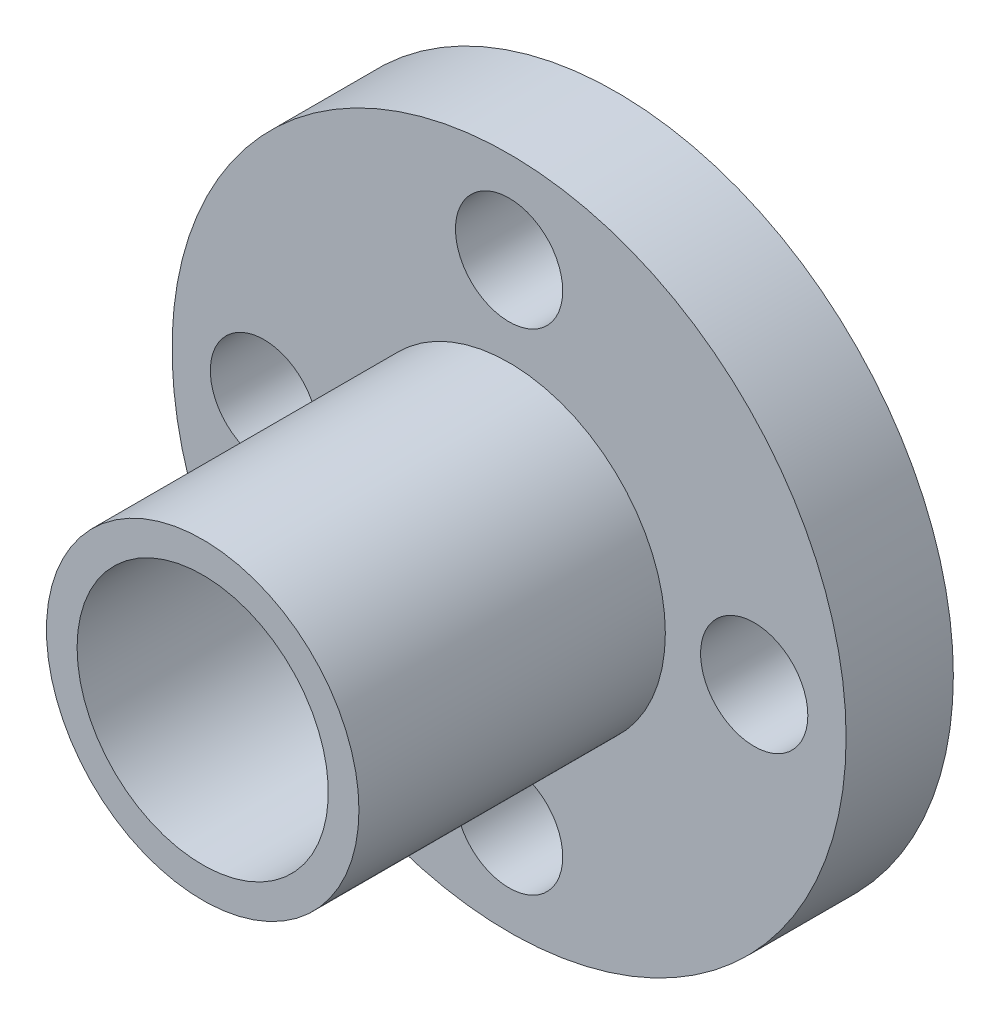
ISO-10303-21;
HEADER;
FILE_DESCRIPTION(('STEP AP214'),'2;1');
FILE_NAME('part.step','',(''),(''),'','','');
FILE_SCHEMA(('AUTOMOTIVE_DESIGN { 1 0 10303 214 1 1 1 1 }'));
ENDSEC;
DATA;
#1=APPLICATION_CONTEXT('core data for automotive mechanical design processes');
#2=APPLICATION_PROTOCOL_DEFINITION('international standard','automotive_design',2000,#1);
#3=PRODUCT_CONTEXT('',#1,'mechanical');
#4=PRODUCT('Part','Part','',(#3));
#5=PRODUCT_RELATED_PRODUCT_CATEGORY('part','',(#4));
#6=PRODUCT_DEFINITION_FORMATION('','',#4);
#7=PRODUCT_DEFINITION_CONTEXT('part definition',#1,'design');
#8=PRODUCT_DEFINITION('design','',#6,#7);
#9=PRODUCT_DEFINITION_SHAPE('','',#8);
#10=(LENGTH_UNIT() NAMED_UNIT(*) SI_UNIT(.MILLI.,.METRE.));
#11=(NAMED_UNIT(*) PLANE_ANGLE_UNIT() SI_UNIT($,.RADIAN.));
#12=(NAMED_UNIT(*) SI_UNIT($,.STERADIAN.) SOLID_ANGLE_UNIT());
#13=UNCERTAINTY_MEASURE_WITH_UNIT(LENGTH_MEASURE(1.E-05),#10,'distance_accuracy_value','');
#14=(GEOMETRIC_REPRESENTATION_CONTEXT(3) GLOBAL_UNCERTAINTY_ASSIGNED_CONTEXT((#13)) GLOBAL_UNIT_ASSIGNED_CONTEXT((#10,
#11,#12)) REPRESENTATION_CONTEXT('',''));
#15=CARTESIAN_POINT('',(0.,0.,0.));
#16=DIRECTION('',(0.,0.,1.));
#17=DIRECTION('',(1.,0.,0.));
#18=AXIS2_PLACEMENT_3D('',#15,#16,#17);
#19=CARTESIAN_POINT('',(0.,0.,15.));
#20=DIRECTION('',(0.,0.,-1.));
#21=DIRECTION('',(-1.,0.,0.));
#22=AXIS2_PLACEMENT_3D('',#19,#20,#21);
#23=CYLINDRICAL_SURFACE('',#22,5.1);
#24=CARTESIAN_POINT('',(0.,0.,5.));
#25=DIRECTION('',(0.,0.,1.));
#26=DIRECTION('',(1.,0.,0.));
#27=AXIS2_PLACEMENT_3D('',#24,#25,#26);
#28=CIRCLE('',#27,5.1);
#29=CARTESIAN_POINT('',(5.1,0.,5.));
#30=VERTEX_POINT('',#29);
#31=EDGE_CURVE('E36',#30,#30,#28,.T.);
#32=ORIENTED_EDGE('',*,*,#31,.T.);
#33=EDGE_LOOP('',(#32));
#34=FACE_BOUND('',#33,.T.);
#35=CARTESIAN_POINT('',(0.,0.,15.));
#36=DIRECTION('',(0.,0.,1.));
#37=DIRECTION('',(1.,0.,0.));
#38=AXIS2_PLACEMENT_3D('',#35,#36,#37);
#39=CIRCLE('',#38,5.1);
#40=CARTESIAN_POINT('',(5.1,0.,15.));
#41=VERTEX_POINT('',#40);
#42=EDGE_CURVE('E40',#41,#41,#39,.T.);
#43=ORIENTED_EDGE('',*,*,#42,.F.);
#44=EDGE_LOOP('',(#43));
#45=FACE_BOUND('',#44,.T.);
#46=ADVANCED_FACE('F33',(#34,#45),#23,.T.);
#47=CARTESIAN_POINT('',(0.,0.,15.));
#48=DIRECTION('',(0.,0.,1.));
#49=DIRECTION('',(1.,0.,0.));
#50=AXIS2_PLACEMENT_3D('',#47,#48,#49);
#51=PLANE('',#50);
#52=CARTESIAN_POINT('',(0.,0.,15.));
#53=DIRECTION('',(0.,0.,-1.));
#54=DIRECTION('',(-1.,0.,0.));
#55=AXIS2_PLACEMENT_3D('',#52,#53,#54);
#56=CIRCLE('',#55,4.1);
#57=CARTESIAN_POINT('',(-4.1,0.,15.));
#58=VERTEX_POINT('',#57);
#59=EDGE_CURVE('E77',#58,#58,#56,.T.);
#60=ORIENTED_EDGE('',*,*,#59,.T.);
#61=EDGE_LOOP('',(#60));
#62=FACE_BOUND('',#61,.T.);
#63=ORIENTED_EDGE('',*,*,#42,.T.);
#64=EDGE_LOOP('',(#63));
#65=FACE_BOUND('',#64,.T.);
#66=ADVANCED_FACE('F86',(#62,#65),#51,.T.);
#67=CARTESIAN_POINT('',(0.,0.,5.));
#68=DIRECTION('',(0.,0.,1.));
#69=DIRECTION('',(1.,0.,0.));
#70=AXIS2_PLACEMENT_3D('',#67,#68,#69);
#71=PLANE('',#70);
#72=ORIENTED_EDGE('',*,*,#31,.F.);
#73=EDGE_LOOP('',(#72));
#74=FACE_BOUND('',#73,.T.);
#75=CARTESIAN_POINT('',(4.52787916007828E-13,-8.,5.));
#76=DIRECTION('',(0.,0.,1.));
#77=DIRECTION('',(1.,0.,0.));
#78=AXIS2_PLACEMENT_3D('',#75,#76,#77);
#79=CIRCLE('',#78,1.75000000000049);
#80=CARTESIAN_POINT('',(1.75000000000094,-8.,5.));
#81=VERTEX_POINT('',#80);
#82=EDGE_CURVE('E65',#81,#81,#79,.T.);
#83=ORIENTED_EDGE('',*,*,#82,.F.);
#84=EDGE_LOOP('',(#83));
#85=FACE_BOUND('',#84,.T.);
#86=CARTESIAN_POINT('',(0.,8.,5.));
#87=DIRECTION('',(0.,0.,1.));
#88=DIRECTION('',(1.,0.,0.));
#89=AXIS2_PLACEMENT_3D('',#86,#87,#88);
#90=CIRCLE('',#89,1.75);
#91=CARTESIAN_POINT('',(1.75,8.,5.));
#92=VERTEX_POINT('',#91);
#93=EDGE_CURVE('E53',#92,#92,#90,.T.);
#94=ORIENTED_EDGE('',*,*,#93,.F.);
#95=EDGE_LOOP('',(#94));
#96=FACE_BOUND('',#95,.T.);
#97=CARTESIAN_POINT('',(0.,0.,5.));
#98=DIRECTION('',(0.,0.,1.));
#99=DIRECTION('',(1.,0.,0.));
#100=AXIS2_PLACEMENT_3D('',#97,#98,#99);
#101=CIRCLE('',#100,11.);
#102=CARTESIAN_POINT('',(11.,0.,5.));
#103=VERTEX_POINT('',#102);
#104=EDGE_CURVE('E52',#103,#103,#101,.T.);
#105=ORIENTED_EDGE('',*,*,#104,.T.);
#106=EDGE_LOOP('',(#105));
#107=FACE_BOUND('',#106,.T.);
#108=CARTESIAN_POINT('',(8.00000000000023,2.26393958003914E-13,5.));
#109=DIRECTION('',(0.,0.,1.));
#110=DIRECTION('',(1.,0.,0.));
#111=AXIS2_PLACEMENT_3D('',#108,#109,#110);
#112=CIRCLE('',#111,1.75000000000018);
#113=CARTESIAN_POINT('',(9.7500000000004,2.26393958003914E-13,5.));
#114=VERTEX_POINT('',#113);
#115=EDGE_CURVE('E59',#114,#114,#112,.T.);
#116=ORIENTED_EDGE('',*,*,#115,.F.);
#117=EDGE_LOOP('',(#116));
#118=FACE_BOUND('',#117,.T.);
#119=CARTESIAN_POINT('',(-7.99999999999977,-2.27373675443232E-13,5.));
#120=DIRECTION('',(0.,0.,1.));
#121=DIRECTION('',(1.,0.,0.));
#122=AXIS2_PLACEMENT_3D('',#119,#120,#121);
#123=CIRCLE('',#122,1.75000000000036);
#124=CARTESIAN_POINT('',(-6.24999999999941,-2.27373675443232E-13,5.));
#125=VERTEX_POINT('',#124);
#126=EDGE_CURVE('E71',#125,#125,#123,.T.);
#127=ORIENTED_EDGE('',*,*,#126,.F.);
#128=EDGE_LOOP('',(#127));
#129=FACE_BOUND('',#128,.T.);
#130=ADVANCED_FACE('F111',(#74,#85,#96,#107,#118,#129),#71,.T.);
#131=CARTESIAN_POINT('',(0.,0.,1.5));
#132=DIRECTION('',(0.,0.,1.));
#133=DIRECTION('',(1.,0.,0.));
#134=AXIS2_PLACEMENT_3D('',#131,#132,#133);
#135=PLANE('',#134);
#136=CARTESIAN_POINT('',(0.,0.,1.5));
#137=DIRECTION('',(0.,0.,1.));
#138=DIRECTION('',(1.,0.,0.));
#139=AXIS2_PLACEMENT_3D('',#136,#137,#138);
#140=CIRCLE('',#139,5.1);
#141=CARTESIAN_POINT('',(5.1,0.,1.5));
#142=VERTEX_POINT('',#141);
#143=EDGE_CURVE('E10',#142,#142,#140,.T.);
#144=ORIENTED_EDGE('',*,*,#143,.T.);
#145=EDGE_LOOP('',(#144));
#146=FACE_BOUND('',#145,.T.);
#147=CARTESIAN_POINT('',(0.,0.,1.5));
#148=DIRECTION('',(0.,0.,1.));
#149=DIRECTION('',(1.,0.,0.));
#150=AXIS2_PLACEMENT_3D('',#147,#148,#149);
#151=CIRCLE('',#150,11.);
#152=CARTESIAN_POINT('',(11.,0.,1.5));
#153=VERTEX_POINT('',#152);
#154=EDGE_CURVE('E49',#153,#153,#151,.T.);
#155=ORIENTED_EDGE('',*,*,#154,.F.);
#156=EDGE_LOOP('',(#155));
#157=FACE_BOUND('',#156,.T.);
#158=CARTESIAN_POINT('',(0.,8.,1.5));
#159=DIRECTION('',(0.,0.,1.));
#160=DIRECTION('',(1.,0.,0.));
#161=AXIS2_PLACEMENT_3D('',#158,#159,#160);
#162=CIRCLE('',#161,1.75);
#163=CARTESIAN_POINT('',(1.75,8.,1.5));
#164=VERTEX_POINT('',#163);
#165=EDGE_CURVE('E56',#164,#164,#162,.T.);
#166=ORIENTED_EDGE('',*,*,#165,.T.);
#167=EDGE_LOOP('',(#166));
#168=FACE_BOUND('',#167,.T.);
#169=CARTESIAN_POINT('',(8.00000000000023,2.26393958003914E-13,1.5));
#170=DIRECTION('',(0.,0.,1.));
#171=DIRECTION('',(1.,0.,0.));
#172=AXIS2_PLACEMENT_3D('',#169,#170,#171);
#173=CIRCLE('',#172,1.75000000000018);
#174=CARTESIAN_POINT('',(9.7500000000004,2.26393958003914E-13,1.5));
#175=VERTEX_POINT('',#174);
#176=EDGE_CURVE('E62',#175,#175,#173,.T.);
#177=ORIENTED_EDGE('',*,*,#176,.T.);
#178=EDGE_LOOP('',(#177));
#179=FACE_BOUND('',#178,.T.);
#180=CARTESIAN_POINT('',(4.52787916007828E-13,-8.,1.5));
#181=DIRECTION('',(0.,0.,1.));
#182=DIRECTION('',(1.,0.,0.));
#183=AXIS2_PLACEMENT_3D('',#180,#181,#182);
#184=CIRCLE('',#183,1.75000000000049);
#185=CARTESIAN_POINT('',(1.75000000000094,-8.,1.5));
#186=VERTEX_POINT('',#185);
#187=EDGE_CURVE('E68',#186,#186,#184,.T.);
#188=ORIENTED_EDGE('',*,*,#187,.T.);
#189=EDGE_LOOP('',(#188));
#190=FACE_BOUND('',#189,.T.);
#191=CARTESIAN_POINT('',(-7.99999999999977,-2.27373675443232E-13,1.5));
#192=DIRECTION('',(0.,0.,1.));
#193=DIRECTION('',(1.,0.,0.));
#194=AXIS2_PLACEMENT_3D('',#191,#192,#193);
#195=CIRCLE('',#194,1.75000000000036);
#196=CARTESIAN_POINT('',(-6.24999999999941,-2.27373675443232E-13,1.5));
#197=VERTEX_POINT('',#196);
#198=EDGE_CURVE('E74',#197,#197,#195,.T.);
#199=ORIENTED_EDGE('',*,*,#198,.T.);
#200=EDGE_LOOP('',(#199));
#201=FACE_BOUND('',#200,.T.);
#202=ADVANCED_FACE('F120',(#146,#157,#168,#179,#190,#201),#135,.F.);
#203=CARTESIAN_POINT('',(0.,0.,5.));
#204=DIRECTION('',(0.,0.,-1.));
#205=DIRECTION('',(-1.,0.,0.));
#206=AXIS2_PLACEMENT_3D('',#203,#204,#205);
#207=CYLINDRICAL_SURFACE('',#206,11.);
#208=ORIENTED_EDGE('',*,*,#104,.F.);
#209=EDGE_LOOP('',(#208));
#210=FACE_BOUND('',#209,.T.);
#211=ORIENTED_EDGE('',*,*,#154,.T.);
#212=EDGE_LOOP('',(#211));
#213=FACE_BOUND('',#212,.T.);
#214=ADVANCED_FACE('F139',(#210,#213),#207,.T.);
#215=CARTESIAN_POINT('',(0.,8.,5.));
#216=DIRECTION('',(0.,0.,-1.));
#217=DIRECTION('',(-1.,0.,0.));
#218=AXIS2_PLACEMENT_3D('',#215,#216,#217);
#219=CYLINDRICAL_SURFACE('',#218,1.75);
#220=ORIENTED_EDGE('',*,*,#93,.T.);
#221=EDGE_LOOP('',(#220));
#222=FACE_BOUND('',#221,.T.);
#223=ORIENTED_EDGE('',*,*,#165,.F.);
#224=EDGE_LOOP('',(#223));
#225=FACE_BOUND('',#224,.T.);
#226=ADVANCED_FACE('F144',(#222,#225),#219,.F.);
#227=CARTESIAN_POINT('',(8.00000000000023,2.26393958003914E-13,5.));
#228=DIRECTION('',(0.,0.,-1.));
#229=DIRECTION('',(-1.,0.,0.));
#230=AXIS2_PLACEMENT_3D('',#227,#228,#229);
#231=CYLINDRICAL_SURFACE('',#230,1.75000000000018);
#232=ORIENTED_EDGE('',*,*,#115,.T.);
#233=EDGE_LOOP('',(#232));
#234=FACE_BOUND('',#233,.T.);
#235=ORIENTED_EDGE('',*,*,#176,.F.);
#236=EDGE_LOOP('',(#235));
#237=FACE_BOUND('',#236,.T.);
#238=ADVANCED_FACE('F151',(#234,#237),#231,.F.);
#239=CARTESIAN_POINT('',(4.52787916007828E-13,-8.,5.));
#240=DIRECTION('',(0.,0.,-1.));
#241=DIRECTION('',(-1.,0.,0.));
#242=AXIS2_PLACEMENT_3D('',#239,#240,#241);
#243=CYLINDRICAL_SURFACE('',#242,1.75000000000049);
#244=ORIENTED_EDGE('',*,*,#82,.T.);
#245=EDGE_LOOP('',(#244));
#246=FACE_BOUND('',#245,.T.);
#247=ORIENTED_EDGE('',*,*,#187,.F.);
#248=EDGE_LOOP('',(#247));
#249=FACE_BOUND('',#248,.T.);
#250=ADVANCED_FACE('F134',(#246,#249),#243,.F.);
#251=CARTESIAN_POINT('',(-7.99999999999977,-2.27373675443232E-13,5.));
#252=DIRECTION('',(0.,0.,-1.));
#253=DIRECTION('',(-1.,0.,0.));
#254=AXIS2_PLACEMENT_3D('',#251,#252,#253);
#255=CYLINDRICAL_SURFACE('',#254,1.75000000000036);
#256=ORIENTED_EDGE('',*,*,#126,.T.);
#257=EDGE_LOOP('',(#256));
#258=FACE_BOUND('',#257,.T.);
#259=ORIENTED_EDGE('',*,*,#198,.F.);
#260=EDGE_LOOP('',(#259));
#261=FACE_BOUND('',#260,.T.);
#262=ADVANCED_FACE('F99',(#258,#261),#255,.F.);
#263=CARTESIAN_POINT('',(0.,0.,0.));
#264=DIRECTION('',(0.,0.,1.));
#265=DIRECTION('',(1.,0.,0.));
#266=AXIS2_PLACEMENT_3D('',#263,#264,#265);
#267=PLANE('',#266);
#268=CARTESIAN_POINT('',(0.,0.,0.));
#269=DIRECTION('',(0.,0.,-1.));
#270=DIRECTION('',(-1.,0.,0.));
#271=AXIS2_PLACEMENT_3D('',#268,#269,#270);
#272=CIRCLE('',#271,4.1);
#273=CARTESIAN_POINT('',(-4.1,0.,0.));
#274=VERTEX_POINT('',#273);
#275=EDGE_CURVE('E80',#274,#274,#272,.T.);
#276=ORIENTED_EDGE('',*,*,#275,.F.);
#277=EDGE_LOOP('',(#276));
#278=FACE_BOUND('',#277,.T.);
#279=CARTESIAN_POINT('',(0.,0.,0.));
#280=DIRECTION('',(0.,0.,1.));
#281=DIRECTION('',(1.,0.,0.));
#282=AXIS2_PLACEMENT_3D('',#279,#280,#281);
#283=CIRCLE('',#282,5.1);
#284=CARTESIAN_POINT('',(5.1,0.,0.));
#285=VERTEX_POINT('',#284);
#286=EDGE_CURVE('E44',#285,#285,#283,.T.);
#287=ORIENTED_EDGE('',*,*,#286,.F.);
#288=EDGE_LOOP('',(#287));
#289=FACE_BOUND('',#288,.T.);
#290=ADVANCED_FACE('F96',(#278,#289),#267,.F.);
#291=ORIENTED_EDGE('',*,*,#286,.T.);
#292=EDGE_LOOP('',(#291));
#293=FACE_BOUND('',#292,.T.);
#294=ORIENTED_EDGE('',*,*,#143,.F.);
#295=EDGE_LOOP('',(#294));
#296=FACE_BOUND('',#295,.T.);
#297=ADVANCED_FACE('F92',(#293,#296),#23,.T.);
#298=CARTESIAN_POINT('',(0.,0.,15.));
#299=DIRECTION('',(0.,0.,-1.));
#300=DIRECTION('',(-1.,0.,0.));
#301=AXIS2_PLACEMENT_3D('',#298,#299,#300);
#302=CYLINDRICAL_SURFACE('',#301,4.1);
#303=ORIENTED_EDGE('',*,*,#59,.F.);
#304=EDGE_LOOP('',(#303));
#305=FACE_BOUND('',#304,.T.);
#306=ORIENTED_EDGE('',*,*,#275,.T.);
#307=EDGE_LOOP('',(#306));
#308=FACE_BOUND('',#307,.T.);
#309=ADVANCED_FACE('F89',(#305,#308),#302,.F.);
#310=CLOSED_SHELL('',(#46,#66,#130,#202,#214,#226,#238,#250,#262,#290,#297,#309));
#311=MANIFOLD_SOLID_BREP('B2',#310);
#312=ADVANCED_BREP_SHAPE_REPRESENTATION('',(#18,#311),#14);
#313=SHAPE_DEFINITION_REPRESENTATION(#9,#312);
ENDSEC;
END-ISO-10303-21;
